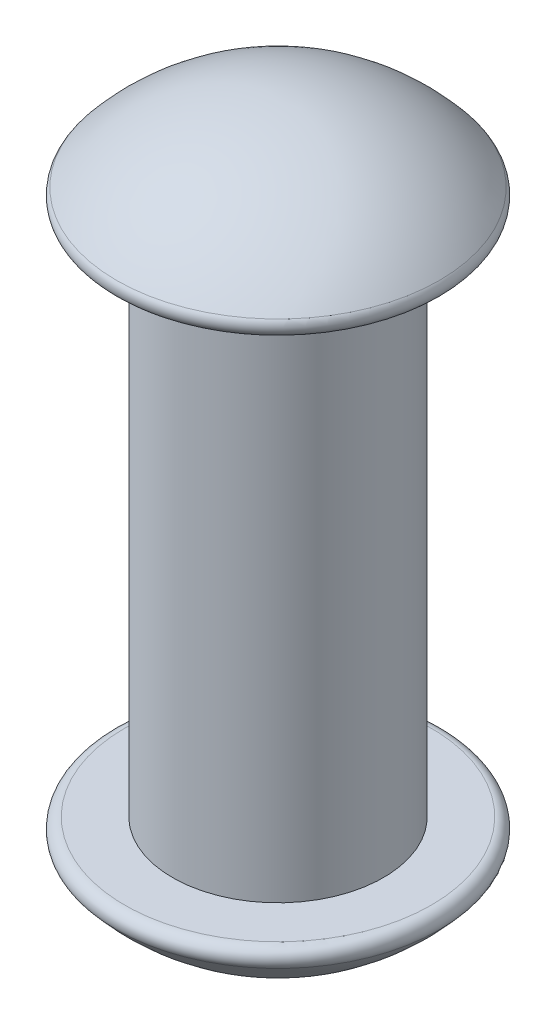
ISO-10303-21;
HEADER;
FILE_DESCRIPTION(('STEP AP214'),'2;1');
FILE_NAME('part.step','',(''),(''),'','','');
FILE_SCHEMA(('AUTOMOTIVE_DESIGN { 1 0 10303 214 1 1 1 1 }'));
ENDSEC;
DATA;
#1=APPLICATION_CONTEXT('core data for automotive mechanical design processes');
#2=APPLICATION_PROTOCOL_DEFINITION('international standard','automotive_design',2000,#1);
#3=PRODUCT_CONTEXT('',#1,'mechanical');
#4=PRODUCT('Part','Part','',(#3));
#5=PRODUCT_RELATED_PRODUCT_CATEGORY('part','',(#4));
#6=PRODUCT_DEFINITION_FORMATION('','',#4);
#7=PRODUCT_DEFINITION_CONTEXT('part definition',#1,'design');
#8=PRODUCT_DEFINITION('design','',#6,#7);
#9=PRODUCT_DEFINITION_SHAPE('','',#8);
#10=(LENGTH_UNIT() NAMED_UNIT(*) SI_UNIT(.MILLI.,.METRE.));
#11=(NAMED_UNIT(*) PLANE_ANGLE_UNIT() SI_UNIT($,.RADIAN.));
#12=(NAMED_UNIT(*) SI_UNIT($,.STERADIAN.) SOLID_ANGLE_UNIT());
#13=UNCERTAINTY_MEASURE_WITH_UNIT(LENGTH_MEASURE(1.E-05),#10,'distance_accuracy_value','');
#14=(GEOMETRIC_REPRESENTATION_CONTEXT(3) GLOBAL_UNCERTAINTY_ASSIGNED_CONTEXT((#13)) GLOBAL_UNIT_ASSIGNED_CONTEXT((#10,
#11,#12)) REPRESENTATION_CONTEXT('',''));
#15=CARTESIAN_POINT('',(0.,0.,0.));
#16=DIRECTION('',(0.,0.,1.));
#17=DIRECTION('',(1.,0.,0.));
#18=AXIS2_PLACEMENT_3D('',#15,#16,#17);
#19=CARTESIAN_POINT('',(0.,2.75,0.));
#20=DIRECTION('',(0.,1.,0.));
#21=DIRECTION('',(1.,0.,0.));
#22=AXIS2_PLACEMENT_3D('',#19,#20,#21);
#23=SPHERICAL_SURFACE('',#22,4.);
#24=CARTESIAN_POINT('',(0.,5.32894736842105,0.));
#25=DIRECTION('',(0.,-1.,0.));
#26=DIRECTION('',(1.,0.,0.));
#27=AXIS2_PLACEMENT_3D('',#24,#25,#26);
#28=CIRCLE('',#27,3.05761843121638);
#29=CARTESIAN_POINT('',(3.05761843121638,5.32894736842105,0.));
#30=VERTEX_POINT('',#29);
#31=EDGE_CURVE('E46',#30,#30,#28,.F.);
#32=ORIENTED_EDGE('',*,*,#31,.T.);
#33=EDGE_LOOP('',(#32));
#34=FACE_BOUND('',#33,.T.);
#35=ADVANCED_FACE('F31',(#34),#23,.T.);
#36=CARTESIAN_POINT('',(2.,5.,0.));
#37=DIRECTION('',(0.,1.,0.));
#38=DIRECTION('',(-1.,0.,0.));
#39=AXIS2_PLACEMENT_3D('',#36,#37,#38);
#40=PLANE('',#39);
#41=CARTESIAN_POINT('',(0.,5.,0.));
#42=DIRECTION('',(0.,1.,0.));
#43=DIRECTION('',(-1.,0.,0.));
#44=AXIS2_PLACEMENT_3D('',#41,#42,#43);
#45=CIRCLE('',#44,2.90473750965556);
#46=CARTESIAN_POINT('',(-2.90473750965556,5.,0.));
#47=VERTEX_POINT('',#46);
#48=EDGE_CURVE('E42',#47,#47,#45,.F.);
#49=ORIENTED_EDGE('',*,*,#48,.T.);
#50=EDGE_LOOP('',(#49));
#51=FACE_BOUND('',#50,.T.);
#52=CARTESIAN_POINT('',(0.,5.,0.));
#53=DIRECTION('',(0.,1.,0.));
#54=DIRECTION('',(-1.,0.,0.));
#55=AXIS2_PLACEMENT_3D('',#52,#53,#54);
#56=CIRCLE('',#55,2.);
#57=CARTESIAN_POINT('',(-2.,5.,0.));
#58=VERTEX_POINT('',#57);
#59=EDGE_CURVE('E51',#58,#58,#56,.T.);
#60=ORIENTED_EDGE('',*,*,#59,.T.);
#61=EDGE_LOOP('',(#60));
#62=FACE_BOUND('',#61,.T.);
#63=ADVANCED_FACE('F72',(#51,#62),#40,.F.);
#64=CARTESIAN_POINT('',(0.,6.75,0.));
#65=DIRECTION('',(0.,1.,0.));
#66=DIRECTION('',(-1.,0.,0.));
#67=AXIS2_PLACEMENT_3D('',#64,#65,#66);
#68=CYLINDRICAL_SURFACE('',#67,2.);
#69=ORIENTED_EDGE('',*,*,#59,.F.);
#70=EDGE_LOOP('',(#69));
#71=FACE_BOUND('',#70,.T.);
#72=CARTESIAN_POINT('',(0.,-5.,0.));
#73=DIRECTION('',(0.,1.,0.));
#74=DIRECTION('',(-1.,0.,0.));
#75=AXIS2_PLACEMENT_3D('',#72,#73,#74);
#76=CIRCLE('',#75,2.);
#77=CARTESIAN_POINT('',(-2.,-5.,0.));
#78=VERTEX_POINT('',#77);
#79=EDGE_CURVE('E54',#78,#78,#76,.T.);
#80=ORIENTED_EDGE('',*,*,#79,.T.);
#81=EDGE_LOOP('',(#80));
#82=FACE_BOUND('',#81,.T.);
#83=ADVANCED_FACE('F58',(#71,#82),#68,.T.);
#84=CARTESIAN_POINT('',(0.,-2.75,0.));
#85=DIRECTION('',(0.,-1.,0.));
#86=DIRECTION('',(1.,0.,0.));
#87=AXIS2_PLACEMENT_3D('',#84,#85,#86);
#88=SPHERICAL_SURFACE('',#87,4.);
#89=CARTESIAN_POINT('',(0.,-5.32894736842105,0.));
#90=DIRECTION('',(0.,1.,0.));
#91=DIRECTION('',(-1.,0.,0.));
#92=AXIS2_PLACEMENT_3D('',#89,#90,#91);
#93=CIRCLE('',#92,3.05761843121638);
#94=CARTESIAN_POINT('',(-3.05761843121638,-5.32894736842105,0.));
#95=VERTEX_POINT('',#94);
#96=EDGE_CURVE('E10',#95,#95,#93,.F.);
#97=ORIENTED_EDGE('',*,*,#96,.T.);
#98=EDGE_LOOP('',(#97));
#99=FACE_BOUND('',#98,.T.);
#100=ADVANCED_FACE('F63',(#99),#88,.T.);
#101=CARTESIAN_POINT('',(2.,-5.,0.));
#102=DIRECTION('',(0.,-1.,0.));
#103=DIRECTION('',(-1.,0.,0.));
#104=AXIS2_PLACEMENT_3D('',#101,#102,#103);
#105=PLANE('',#104);
#106=CARTESIAN_POINT('',(0.,-5.,0.));
#107=DIRECTION('',(0.,-1.,0.));
#108=DIRECTION('',(1.,0.,0.));
#109=AXIS2_PLACEMENT_3D('',#106,#107,#108);
#110=CIRCLE('',#109,2.90473750965556);
#111=CARTESIAN_POINT('',(2.90473750965556,-5.,0.));
#112=VERTEX_POINT('',#111);
#113=EDGE_CURVE('E38',#112,#112,#110,.F.);
#114=ORIENTED_EDGE('',*,*,#113,.T.);
#115=EDGE_LOOP('',(#114));
#116=FACE_BOUND('',#115,.T.);
#117=ORIENTED_EDGE('',*,*,#79,.F.);
#118=EDGE_LOOP('',(#117));
#119=FACE_BOUND('',#118,.T.);
#120=ADVANCED_FACE('F60',(#116,#119),#105,.F.);
#121=CARTESIAN_POINT('',(0.,5.2,0.));
#122=DIRECTION('',(0.,1.,0.));
#123=DIRECTION('',(-1.,0.,0.));
#124=AXIS2_PLACEMENT_3D('',#121,#122,#123);
#125=TOROIDAL_SURFACE('',#124,2.90473750965556,0.2);
#126=ORIENTED_EDGE('',*,*,#48,.F.);
#127=EDGE_LOOP('',(#126));
#128=FACE_BOUND('',#127,.T.);
#129=ORIENTED_EDGE('',*,*,#31,.F.);
#130=EDGE_LOOP('',(#129));
#131=FACE_BOUND('',#130,.T.);
#132=ADVANCED_FACE('F62',(#128,#131),#125,.T.);
#133=CARTESIAN_POINT('',(0.,-5.2,0.));
#134=DIRECTION('',(0.,-1.,0.));
#135=DIRECTION('',(1.,0.,0.));
#136=AXIS2_PLACEMENT_3D('',#133,#134,#135);
#137=TOROIDAL_SURFACE('',#136,2.90473750965556,0.2);
#138=ORIENTED_EDGE('',*,*,#96,.F.);
#139=EDGE_LOOP('',(#138));
#140=FACE_BOUND('',#139,.T.);
#141=ORIENTED_EDGE('',*,*,#113,.F.);
#142=EDGE_LOOP('',(#141));
#143=FACE_BOUND('',#142,.T.);
#144=ADVANCED_FACE('F33',(#140,#143),#137,.T.);
#145=CLOSED_SHELL('',(#35,#63,#83,#100,#120,#132,#144));
#146=MANIFOLD_SOLID_BREP('B2',#145);
#147=ADVANCED_BREP_SHAPE_REPRESENTATION('',(#18,#146),#14);
#148=SHAPE_DEFINITION_REPRESENTATION(#9,#147);
ENDSEC;
END-ISO-10303-21;
